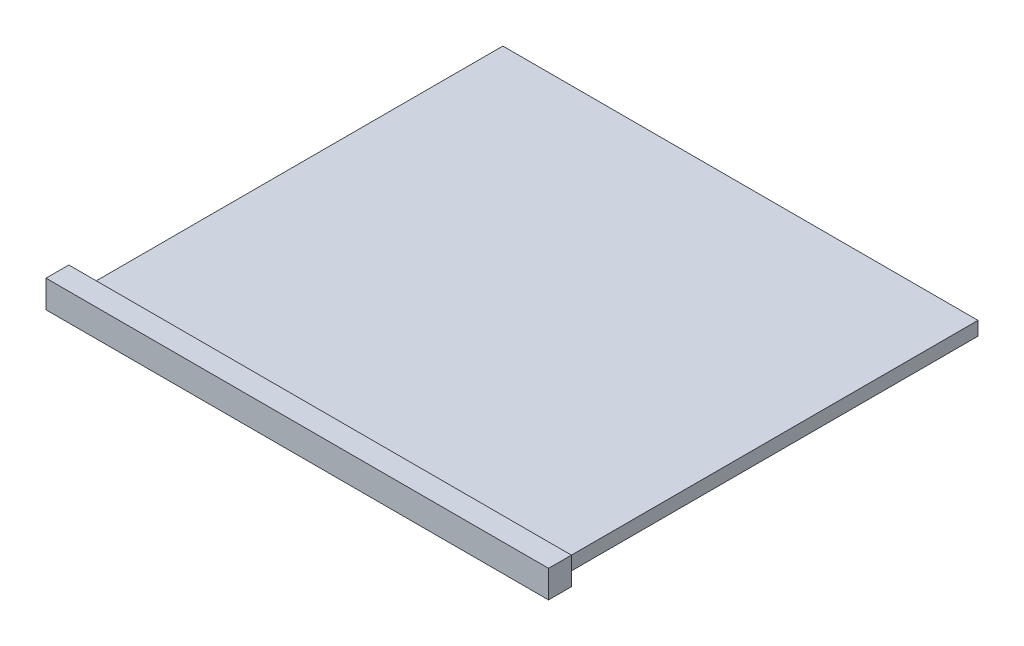
ISO-10303-21;
HEADER;
FILE_DESCRIPTION(('STEP AP214'),'2;1');
FILE_NAME('part.step','',(''),(''),'','','');
FILE_SCHEMA(('AUTOMOTIVE_DESIGN { 1 0 10303 214 1 1 1 1 }'));
ENDSEC;
DATA;
#1=APPLICATION_CONTEXT('core data for automotive mechanical design processes');
#2=APPLICATION_PROTOCOL_DEFINITION('international standard','automotive_design',2000,#1);
#3=PRODUCT_CONTEXT('',#1,'mechanical');
#4=PRODUCT('Part','Part','',(#3));
#5=PRODUCT_RELATED_PRODUCT_CATEGORY('part','',(#4));
#6=PRODUCT_DEFINITION_FORMATION('','',#4);
#7=PRODUCT_DEFINITION_CONTEXT('part definition',#1,'design');
#8=PRODUCT_DEFINITION('design','',#6,#7);
#9=PRODUCT_DEFINITION_SHAPE('','',#8);
#10=(LENGTH_UNIT() NAMED_UNIT(*) SI_UNIT(.MILLI.,.METRE.));
#11=(NAMED_UNIT(*) PLANE_ANGLE_UNIT() SI_UNIT($,.RADIAN.));
#12=(NAMED_UNIT(*) SI_UNIT($,.STERADIAN.) SOLID_ANGLE_UNIT());
#13=UNCERTAINTY_MEASURE_WITH_UNIT(LENGTH_MEASURE(1.E-05),#10,'distance_accuracy_value','');
#14=(GEOMETRIC_REPRESENTATION_CONTEXT(3) GLOBAL_UNCERTAINTY_ASSIGNED_CONTEXT((#13)) GLOBAL_UNIT_ASSIGNED_CONTEXT((#10,
#11,#12)) REPRESENTATION_CONTEXT('',''));
#15=CARTESIAN_POINT('',(0.,0.,0.));
#16=DIRECTION('',(0.,0.,1.));
#17=DIRECTION('',(1.,0.,0.));
#18=AXIS2_PLACEMENT_3D('',#15,#16,#17);
#19=CARTESIAN_POINT('',(52.,-3.,-5.));
#20=DIRECTION('',(1.,0.,0.));
#21=DIRECTION('',(0.,0.,-1.));
#22=AXIS2_PLACEMENT_3D('',#19,#20,#21);
#23=PLANE('',#22);
#24=DIRECTION('',(0.,1.,0.));
#25=VECTOR('',#24,1.);
#26=CARTESIAN_POINT('',(52.,3.,-5.));
#27=LINE('',#26,#25);
#28=CARTESIAN_POINT('',(52.,-3.,-5.));
#29=VERTEX_POINT('',#28);
#30=CARTESIAN_POINT('',(52.,0.,-5.));
#31=VERTEX_POINT('',#30);
#32=EDGE_CURVE('E56',#29,#31,#27,.T.);
#33=ORIENTED_EDGE('',*,*,#32,.F.);
#34=DIRECTION('',(0.,0.,1.));
#35=VECTOR('',#34,1.);
#36=CARTESIAN_POINT('',(52.,-3.,-5.));
#37=LINE('',#36,#35);
#38=CARTESIAN_POINT('',(52.,-3.,-97.));
#39=VERTEX_POINT('',#38);
#40=EDGE_CURVE('E48',#39,#29,#37,.T.);
#41=ORIENTED_EDGE('',*,*,#40,.F.);
#42=DIRECTION('',(0.,-1.,0.));
#43=VECTOR('',#42,1.);
#44=CARTESIAN_POINT('',(52.,-3.,-97.));
#45=LINE('',#44,#43);
#46=CARTESIAN_POINT('',(52.,0.,-97.));
#47=VERTEX_POINT('',#46);
#48=EDGE_CURVE('E163',#47,#39,#45,.T.);
#49=ORIENTED_EDGE('',*,*,#48,.F.);
#50=DIRECTION('',(0.,0.,1.));
#51=VECTOR('',#50,1.);
#52=CARTESIAN_POINT('',(52.,0.,-97.));
#53=LINE('',#52,#51);
#54=EDGE_CURVE('E177',#47,#31,#53,.T.);
#55=ORIENTED_EDGE('',*,*,#54,.T.);
#56=EDGE_LOOP('',(#33,#41,#49,#55));
#57=FACE_BOUND('',#56,.T.);
#58=ADVANCED_FACE('F39',(#57),#23,.T.);
#59=CARTESIAN_POINT('',(-52.,-3.,-5.));
#60=DIRECTION('',(0.,-1.,0.));
#61=DIRECTION('',(0.,0.,-1.));
#62=AXIS2_PLACEMENT_3D('',#59,#60,#61);
#63=PLANE('',#62);
#64=DIRECTION('',(1.,0.,0.));
#65=VECTOR('',#64,1.);
#66=CARTESIAN_POINT('',(-52.,-3.,0.));
#67=LINE('',#66,#65);
#68=CARTESIAN_POINT('',(-55.,-3.,0.));
#69=VERTEX_POINT('',#68);
#70=CARTESIAN_POINT('',(55.,-3.,0.));
#71=VERTEX_POINT('',#70);
#72=EDGE_CURVE('E117',#69,#71,#67,.T.);
#73=ORIENTED_EDGE('',*,*,#72,.F.);
#74=DIRECTION('',(0.,0.,1.));
#75=VECTOR('',#74,1.);
#76=CARTESIAN_POINT('',(-55.,-3.,0.));
#77=LINE('',#76,#75);
#78=CARTESIAN_POINT('',(-55.,-3.,-5.00000000000002));
#79=VERTEX_POINT('',#78);
#80=EDGE_CURVE('E132',#79,#69,#77,.T.);
#81=ORIENTED_EDGE('',*,*,#80,.F.);
#82=DIRECTION('',(1.,0.,0.));
#83=VECTOR('',#82,1.);
#84=CARTESIAN_POINT('',(-55.,-3.,-5.00000000000002));
#85=LINE('',#84,#83);
#86=CARTESIAN_POINT('',(-52.,-3.,-5.00000000000002));
#87=VERTEX_POINT('',#86);
#88=EDGE_CURVE('E139',#79,#87,#85,.T.);
#89=ORIENTED_EDGE('',*,*,#88,.T.);
#90=DIRECTION('',(0.,0.,1.));
#91=VECTOR('',#90,1.);
#92=CARTESIAN_POINT('',(-52.,-3.,-5.));
#93=LINE('',#92,#91);
#94=CARTESIAN_POINT('',(-52.,-3.,-97.));
#95=VERTEX_POINT('',#94);
#96=EDGE_CURVE('E42',#95,#87,#93,.T.);
#97=ORIENTED_EDGE('',*,*,#96,.F.);
#98=DIRECTION('',(-1.,0.,0.));
#99=VECTOR('',#98,1.);
#100=CARTESIAN_POINT('',(52.,-3.,-97.));
#101=LINE('',#100,#99);
#102=EDGE_CURVE('E167',#39,#95,#101,.T.);
#103=ORIENTED_EDGE('',*,*,#102,.F.);
#104=ORIENTED_EDGE('',*,*,#40,.T.);
#105=DIRECTION('',(-1.,0.,0.));
#106=VECTOR('',#105,1.);
#107=CARTESIAN_POINT('',(55.,-3.,-5.));
#108=LINE('',#107,#106);
#109=CARTESIAN_POINT('',(55.,-3.,-5.));
#110=VERTEX_POINT('',#109);
#111=EDGE_CURVE('E156',#110,#29,#108,.T.);
#112=ORIENTED_EDGE('',*,*,#111,.F.);
#113=DIRECTION('',(0.,0.,-1.));
#114=VECTOR('',#113,1.);
#115=CARTESIAN_POINT('',(55.,-3.,-5.));
#116=LINE('',#115,#114);
#117=EDGE_CURVE('E153',#71,#110,#116,.T.);
#118=ORIENTED_EDGE('',*,*,#117,.F.);
#119=EDGE_LOOP('',(#73,#81,#89,#97,#103,#104,#112,#118));
#120=FACE_BOUND('',#119,.T.);
#121=ADVANCED_FACE('F198',(#120),#63,.T.);
#122=CARTESIAN_POINT('',(-52.,-3.,-5.));
#123=DIRECTION('',(-1.,0.,0.));
#124=DIRECTION('',(0.,0.,1.));
#125=AXIS2_PLACEMENT_3D('',#122,#123,#124);
#126=PLANE('',#125);
#127=DIRECTION('',(0.,-1.,0.));
#128=VECTOR('',#127,1.);
#129=CARTESIAN_POINT('',(-52.,3.,-5.00000000000002));
#130=LINE('',#129,#128);
#131=CARTESIAN_POINT('',(-52.,0.,-5.));
#132=VERTEX_POINT('',#131);
#133=EDGE_CURVE('E11',#132,#87,#130,.T.);
#134=ORIENTED_EDGE('',*,*,#133,.F.);
#135=DIRECTION('',(0.,0.,1.));
#136=VECTOR('',#135,1.);
#137=CARTESIAN_POINT('',(-52.,0.,-97.));
#138=LINE('',#137,#136);
#139=CARTESIAN_POINT('',(-52.,0.,-97.));
#140=VERTEX_POINT('',#139);
#141=EDGE_CURVE('E118',#140,#132,#138,.T.);
#142=ORIENTED_EDGE('',*,*,#141,.F.);
#143=DIRECTION('',(0.,1.,0.));
#144=VECTOR('',#143,1.);
#145=CARTESIAN_POINT('',(-52.,-3.,-97.));
#146=LINE('',#145,#144);
#147=EDGE_CURVE('E171',#95,#140,#146,.T.);
#148=ORIENTED_EDGE('',*,*,#147,.F.);
#149=ORIENTED_EDGE('',*,*,#96,.T.);
#150=EDGE_LOOP('',(#134,#142,#148,#149));
#151=FACE_BOUND('',#150,.T.);
#152=ADVANCED_FACE('F194',(#151),#126,.T.);
#153=CARTESIAN_POINT('',(-52.,3.,-5.));
#154=DIRECTION('',(0.,1.,0.));
#155=DIRECTION('',(0.,0.,1.));
#156=AXIS2_PLACEMENT_3D('',#153,#154,#155);
#157=PLANE('',#156);
#158=DIRECTION('',(-1.,0.,0.));
#159=VECTOR('',#158,1.);
#160=CARTESIAN_POINT('',(-52.,3.,0.));
#161=LINE('',#160,#159);
#162=CARTESIAN_POINT('',(55.,3.,0.));
#163=VERTEX_POINT('',#162);
#164=CARTESIAN_POINT('',(-55.,3.,0.));
#165=VERTEX_POINT('',#164);
#166=EDGE_CURVE('E106',#163,#165,#161,.T.);
#167=ORIENTED_EDGE('',*,*,#166,.F.);
#168=DIRECTION('',(0.,0.,1.));
#169=VECTOR('',#168,1.);
#170=CARTESIAN_POINT('',(55.,3.,-5.));
#171=LINE('',#170,#169);
#172=CARTESIAN_POINT('',(55.,3.,-5.));
#173=VERTEX_POINT('',#172);
#174=EDGE_CURVE('E148',#173,#163,#171,.T.);
#175=ORIENTED_EDGE('',*,*,#174,.F.);
#176=DIRECTION('',(-1.,0.,0.));
#177=VECTOR('',#176,1.);
#178=CARTESIAN_POINT('',(-52.,3.,-5.));
#179=LINE('',#178,#177);
#180=CARTESIAN_POINT('',(-55.,3.,-5.00000000000002));
#181=VERTEX_POINT('',#180);
#182=EDGE_CURVE('E123',#173,#181,#179,.T.);
#183=ORIENTED_EDGE('',*,*,#182,.T.);
#184=DIRECTION('',(0.,0.,-1.));
#185=VECTOR('',#184,1.);
#186=CARTESIAN_POINT('',(-55.,3.,0.));
#187=LINE('',#186,#185);
#188=EDGE_CURVE('E121',#165,#181,#187,.T.);
#189=ORIENTED_EDGE('',*,*,#188,.F.);
#190=EDGE_LOOP('',(#167,#175,#183,#189));
#191=FACE_BOUND('',#190,.T.);
#192=ADVANCED_FACE('F122',(#191),#157,.T.);
#193=CARTESIAN_POINT('',(0.,0.,-5.));
#194=DIRECTION('',(0.,0.,-1.));
#195=DIRECTION('',(-1.,0.,0.));
#196=AXIS2_PLACEMENT_3D('',#193,#194,#195);
#197=PLANE('',#196);
#198=DIRECTION('',(1.,0.,0.));
#199=VECTOR('',#198,1.);
#200=CARTESIAN_POINT('',(52.,0.,-5.));
#201=LINE('',#200,#199);
#202=EDGE_CURVE('E162',#132,#31,#201,.T.);
#203=ORIENTED_EDGE('',*,*,#202,.F.);
#204=ORIENTED_EDGE('',*,*,#133,.T.);
#205=ORIENTED_EDGE('',*,*,#88,.F.);
#206=DIRECTION('',(0.,-1.,0.));
#207=VECTOR('',#206,1.);
#208=CARTESIAN_POINT('',(-55.,3.,-5.00000000000002));
#209=LINE('',#208,#207);
#210=EDGE_CURVE('E127',#181,#79,#209,.T.);
#211=ORIENTED_EDGE('',*,*,#210,.F.);
#212=ORIENTED_EDGE('',*,*,#182,.F.);
#213=DIRECTION('',(0.,1.,0.));
#214=VECTOR('',#213,1.);
#215=CARTESIAN_POINT('',(55.,3.,-5.));
#216=LINE('',#215,#214);
#217=EDGE_CURVE('E144',#110,#173,#216,.T.);
#218=ORIENTED_EDGE('',*,*,#217,.F.);
#219=ORIENTED_EDGE('',*,*,#111,.T.);
#220=ORIENTED_EDGE('',*,*,#32,.T.);
#221=EDGE_LOOP('',(#203,#204,#205,#211,#212,#218,#219,#220));
#222=FACE_BOUND('',#221,.T.);
#223=ADVANCED_FACE('F197',(#222),#197,.T.);
#224=CARTESIAN_POINT('',(0.,0.,0.));
#225=DIRECTION('',(0.,0.,-1.));
#226=DIRECTION('',(-1.,0.,0.));
#227=AXIS2_PLACEMENT_3D('',#224,#225,#226);
#228=PLANE('',#227);
#229=ORIENTED_EDGE('',*,*,#72,.T.);
#230=DIRECTION('',(0.,-1.,0.));
#231=VECTOR('',#230,1.);
#232=CARTESIAN_POINT('',(55.,3.,0.));
#233=LINE('',#232,#231);
#234=EDGE_CURVE('E112',#163,#71,#233,.T.);
#235=ORIENTED_EDGE('',*,*,#234,.F.);
#236=ORIENTED_EDGE('',*,*,#166,.T.);
#237=DIRECTION('',(0.,1.,0.));
#238=VECTOR('',#237,1.);
#239=CARTESIAN_POINT('',(-55.,3.,0.));
#240=LINE('',#239,#238);
#241=EDGE_CURVE('E110',#69,#165,#240,.T.);
#242=ORIENTED_EDGE('',*,*,#241,.F.);
#243=EDGE_LOOP('',(#229,#235,#236,#242));
#244=FACE_BOUND('',#243,.T.);
#245=ADVANCED_FACE('F108',(#244),#228,.F.);
#246=CARTESIAN_POINT('',(52.,0.,-97.));
#247=DIRECTION('',(0.,-1.,0.));
#248=DIRECTION('',(0.,0.,-1.));
#249=AXIS2_PLACEMENT_3D('',#246,#247,#248);
#250=PLANE('',#249);
#251=ORIENTED_EDGE('',*,*,#202,.T.);
#252=ORIENTED_EDGE('',*,*,#54,.F.);
#253=DIRECTION('',(1.,0.,0.));
#254=VECTOR('',#253,1.);
#255=CARTESIAN_POINT('',(52.,0.,-97.));
#256=LINE('',#255,#254);
#257=EDGE_CURVE('E174',#140,#47,#256,.T.);
#258=ORIENTED_EDGE('',*,*,#257,.F.);
#259=ORIENTED_EDGE('',*,*,#141,.T.);
#260=EDGE_LOOP('',(#251,#252,#258,#259));
#261=FACE_BOUND('',#260,.T.);
#262=ADVANCED_FACE('F211',(#261),#250,.F.);
#263=CARTESIAN_POINT('',(0.,0.,-97.));
#264=DIRECTION('',(0.,0.,1.));
#265=DIRECTION('',(1.,0.,0.));
#266=AXIS2_PLACEMENT_3D('',#263,#264,#265);
#267=PLANE('',#266);
#268=ORIENTED_EDGE('',*,*,#48,.T.);
#269=ORIENTED_EDGE('',*,*,#102,.T.);
#270=ORIENTED_EDGE('',*,*,#147,.T.);
#271=ORIENTED_EDGE('',*,*,#257,.T.);
#272=EDGE_LOOP('',(#268,#269,#270,#271));
#273=FACE_BOUND('',#272,.T.);
#274=ADVANCED_FACE('F204',(#273),#267,.F.);
#275=CARTESIAN_POINT('',(55.,0.,0.));
#276=DIRECTION('',(-1.,0.,0.));
#277=DIRECTION('',(0.,0.,1.));
#278=AXIS2_PLACEMENT_3D('',#275,#276,#277);
#279=PLANE('',#278);
#280=ORIENTED_EDGE('',*,*,#217,.T.);
#281=ORIENTED_EDGE('',*,*,#174,.T.);
#282=ORIENTED_EDGE('',*,*,#234,.T.);
#283=ORIENTED_EDGE('',*,*,#117,.T.);
#284=EDGE_LOOP('',(#280,#281,#282,#283));
#285=FACE_BOUND('',#284,.T.);
#286=ADVANCED_FACE('F201',(#285),#279,.F.);
#287=CARTESIAN_POINT('',(-55.,0.,0.));
#288=DIRECTION('',(1.,0.,0.));
#289=DIRECTION('',(0.,0.,-1.));
#290=AXIS2_PLACEMENT_3D('',#287,#288,#289);
#291=PLANE('',#290);
#292=ORIENTED_EDGE('',*,*,#241,.T.);
#293=ORIENTED_EDGE('',*,*,#188,.T.);
#294=ORIENTED_EDGE('',*,*,#210,.T.);
#295=ORIENTED_EDGE('',*,*,#80,.T.);
#296=EDGE_LOOP('',(#292,#293,#294,#295));
#297=FACE_BOUND('',#296,.T.);
#298=ADVANCED_FACE('F130',(#297),#291,.F.);
#299=CLOSED_SHELL('',(#58,#121,#152,#192,#223,#245,#262,#274,#286,#298));
#300=MANIFOLD_SOLID_BREP('B2',#299);
#301=ADVANCED_BREP_SHAPE_REPRESENTATION('',(#18,#300),#14);
#302=SHAPE_DEFINITION_REPRESENTATION(#9,#301);
ENDSEC;
END-ISO-10303-21;
